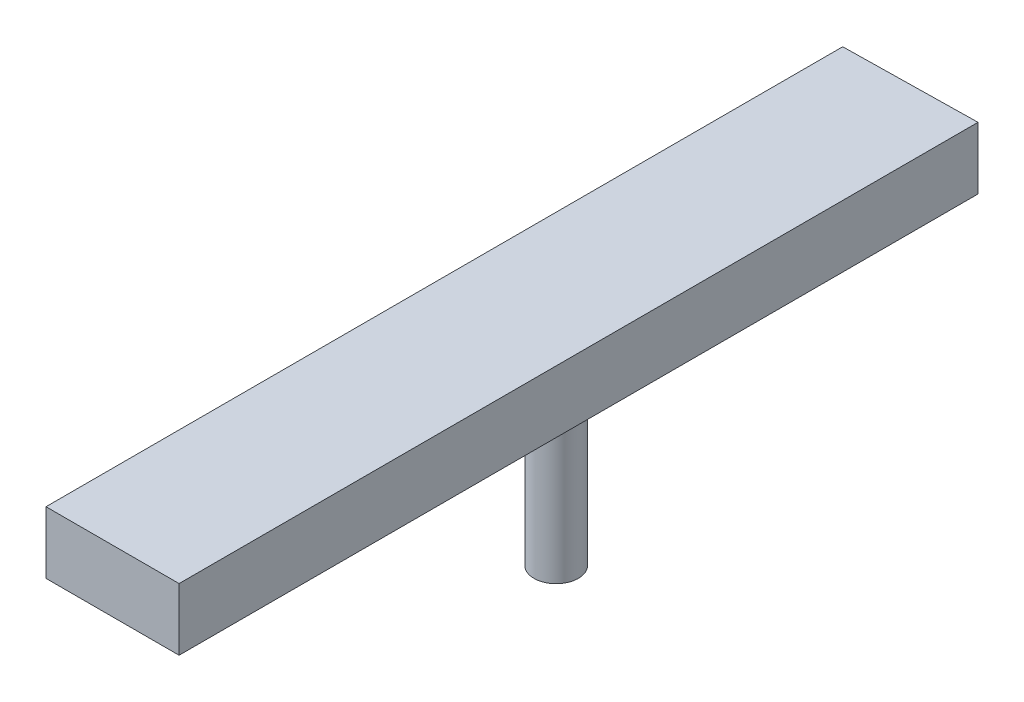
ISO-10303-21;
HEADER;
FILE_DESCRIPTION(('STEP AP214'),'2;1');
FILE_NAME('part.step','',(''),(''),'','','');
FILE_SCHEMA(('AUTOMOTIVE_DESIGN { 1 0 10303 214 1 1 1 1 }'));
ENDSEC;
DATA;
#1=APPLICATION_CONTEXT('core data for automotive mechanical design processes');
#2=APPLICATION_PROTOCOL_DEFINITION('international standard','automotive_design',2000,#1);
#3=PRODUCT_CONTEXT('',#1,'mechanical');
#4=PRODUCT('Part','Part','',(#3));
#5=PRODUCT_RELATED_PRODUCT_CATEGORY('part','',(#4));
#6=PRODUCT_DEFINITION_FORMATION('','',#4);
#7=PRODUCT_DEFINITION_CONTEXT('part definition',#1,'design');
#8=PRODUCT_DEFINITION('design','',#6,#7);
#9=PRODUCT_DEFINITION_SHAPE('','',#8);
#10=(LENGTH_UNIT() NAMED_UNIT(*) SI_UNIT(.MILLI.,.METRE.));
#11=(NAMED_UNIT(*) PLANE_ANGLE_UNIT() SI_UNIT($,.RADIAN.));
#12=(NAMED_UNIT(*) SI_UNIT($,.STERADIAN.) SOLID_ANGLE_UNIT());
#13=UNCERTAINTY_MEASURE_WITH_UNIT(LENGTH_MEASURE(1.E-05),#10,'distance_accuracy_value','');
#14=(GEOMETRIC_REPRESENTATION_CONTEXT(3) GLOBAL_UNCERTAINTY_ASSIGNED_CONTEXT((#13)) GLOBAL_UNIT_ASSIGNED_CONTEXT((#10,
#11,#12)) REPRESENTATION_CONTEXT('',''));
#15=CARTESIAN_POINT('',(0.,0.,0.));
#16=DIRECTION('',(0.,0.,1.));
#17=DIRECTION('',(1.,0.,0.));
#18=AXIS2_PLACEMENT_3D('',#15,#16,#17);
#19=CARTESIAN_POINT('',(7.49999983236194,0.,78.2764728704216));
#20=DIRECTION('',(0.,-1.,0.));
#21=DIRECTION('',(0.,0.,-1.));
#22=AXIS2_PLACEMENT_3D('',#19,#20,#21);
#23=PLANE('',#22);
#24=CARTESIAN_POINT('',(3.75000016356773,0.,35.0000012364363));
#25=DIRECTION('',(0.,-1.,0.));
#26=DIRECTION('',(0.,0.,-1.));
#27=AXIS2_PLACEMENT_3D('',#24,#25,#26);
#28=CIRCLE('',#27,1.2499992750272);
#29=CARTESIAN_POINT('',(3.75000016356773,0.,33.7500019614091));
#30=VERTEX_POINT('',#29);
#31=EDGE_CURVE('E11',#30,#30,#28,.T.);
#32=ORIENTED_EDGE('',*,*,#31,.F.);
#33=EDGE_LOOP('',(#32));
#34=FACE_BOUND('',#33,.T.);
#35=DIRECTION('',(0.,0.,-1.));
#36=VECTOR('',#35,1.);
#37=CARTESIAN_POINT('',(7.49999983236194,0.,78.2764728704216));
#38=LINE('',#37,#36);
#39=CARTESIAN_POINT('',(7.49999983236194,0.,60.0000002980232));
#40=VERTEX_POINT('',#39);
#41=CARTESIAN_POINT('',(7.49999983236194,0.,14.9775894310468));
#42=VERTEX_POINT('',#41);
#43=EDGE_CURVE('E47',#40,#42,#38,.T.);
#44=ORIENTED_EDGE('',*,*,#43,.F.);
#45=DIRECTION('',(1.,0.,0.));
#46=VECTOR('',#45,1.);
#47=CARTESIAN_POINT('',(0.,0.,60.0000002980232));
#48=LINE('',#47,#46);
#49=CARTESIAN_POINT('',(0.,0.,60.0000002980232));
#50=VERTEX_POINT('',#49);
#51=EDGE_CURVE('E54',#50,#40,#48,.T.);
#52=ORIENTED_EDGE('',*,*,#51,.F.);
#53=DIRECTION('',(0.,0.,-1.));
#54=VECTOR('',#53,1.);
#55=CARTESIAN_POINT('',(0.,0.,78.2764728704216));
#56=LINE('',#55,#54);
#57=CARTESIAN_POINT('',(0.,0.,15.1018444358906));
#58=VERTEX_POINT('',#57);
#59=EDGE_CURVE('E90',#50,#58,#56,.T.);
#60=ORIENTED_EDGE('',*,*,#59,.T.);
#61=DIRECTION('',(-0.999862789961335,0.,0.0165650611449047));
#62=VECTOR('',#61,1.);
#63=CARTESIAN_POINT('',(7.36187995923574,0.,14.9798777091652));
#64=LINE('',#63,#62);
#65=EDGE_CURVE('E110',#42,#58,#64,.T.);
#66=ORIENTED_EDGE('',*,*,#65,.F.);
#67=EDGE_LOOP('',(#44,#52,#60,#66));
#68=FACE_BOUND('',#67,.T.);
#69=ADVANCED_FACE('F40',(#34,#68),#23,.T.);
#70=CARTESIAN_POINT('',(0.,3.50000010803342,78.2764728704216));
#71=DIRECTION('',(-1.,0.,0.));
#72=DIRECTION('',(0.,0.,1.));
#73=AXIS2_PLACEMENT_3D('',#70,#71,#72);
#74=PLANE('',#73);
#75=ORIENTED_EDGE('',*,*,#59,.F.);
#76=DIRECTION('',(0.,-1.,0.));
#77=VECTOR('',#76,1.);
#78=CARTESIAN_POINT('',(0.,3.50000010803342,60.0000002980232));
#79=LINE('',#78,#77);
#80=CARTESIAN_POINT('',(0.,3.50000010803342,60.0000002980232));
#81=VERTEX_POINT('',#80);
#82=EDGE_CURVE('E80',#81,#50,#79,.T.);
#83=ORIENTED_EDGE('',*,*,#82,.F.);
#84=DIRECTION('',(0.,0.,-1.));
#85=VECTOR('',#84,1.);
#86=CARTESIAN_POINT('',(0.,3.50000010803342,78.2764728704216));
#87=LINE('',#86,#85);
#88=CARTESIAN_POINT('',(0.,3.50000010803342,15.1018444358906));
#89=VERTEX_POINT('',#88);
#90=EDGE_CURVE('E98',#81,#89,#87,.T.);
#91=ORIENTED_EDGE('',*,*,#90,.T.);
#92=DIRECTION('',(0.,1.,0.));
#93=VECTOR('',#92,1.);
#94=CARTESIAN_POINT('',(0.,0.,15.1018444358906));
#95=LINE('',#94,#93);
#96=EDGE_CURVE('E97',#58,#89,#95,.T.);
#97=ORIENTED_EDGE('',*,*,#96,.F.);
#98=EDGE_LOOP('',(#75,#83,#91,#97));
#99=FACE_BOUND('',#98,.T.);
#100=ADVANCED_FACE('F95',(#99),#74,.T.);
#101=CARTESIAN_POINT('',(7.49999983236194,3.50000010803342,78.2764728704216));
#102=DIRECTION('',(0.,1.,0.));
#103=DIRECTION('',(0.,0.,1.));
#104=AXIS2_PLACEMENT_3D('',#101,#102,#103);
#105=PLANE('',#104);
#106=ORIENTED_EDGE('',*,*,#90,.F.);
#107=DIRECTION('',(-1.,0.,0.));
#108=VECTOR('',#107,1.);
#109=CARTESIAN_POINT('',(0.,3.50000010803342,60.0000002980232));
#110=LINE('',#109,#108);
#111=CARTESIAN_POINT('',(7.49999983236194,3.50000010803342,60.0000002980232));
#112=VERTEX_POINT('',#111);
#113=EDGE_CURVE('E82',#112,#81,#110,.T.);
#114=ORIENTED_EDGE('',*,*,#113,.F.);
#115=DIRECTION('',(0.,0.,-1.));
#116=VECTOR('',#115,1.);
#117=CARTESIAN_POINT('',(7.49999983236194,3.50000010803342,78.2764728704216));
#118=LINE('',#117,#116);
#119=CARTESIAN_POINT('',(7.49999983236194,3.50000010803342,14.9775894310468));
#120=VERTEX_POINT('',#119);
#121=EDGE_CURVE('E62',#112,#120,#118,.T.);
#122=ORIENTED_EDGE('',*,*,#121,.T.);
#123=DIRECTION('',(0.999862789961335,0.,-0.0165650611449047));
#124=VECTOR('',#123,1.);
#125=CARTESIAN_POINT('',(-0.136061863791688,3.50000010803342,15.1040986182803));
#126=LINE('',#125,#124);
#127=EDGE_CURVE('E103',#89,#120,#126,.T.);
#128=ORIENTED_EDGE('',*,*,#127,.F.);
#129=EDGE_LOOP('',(#106,#114,#122,#128));
#130=FACE_BOUND('',#129,.T.);
#131=ADVANCED_FACE('F117',(#130),#105,.T.);
#132=CARTESIAN_POINT('',(7.49999983236194,3.50000010803342,78.2764728704216));
#133=DIRECTION('',(1.,0.,0.));
#134=DIRECTION('',(0.,0.,-1.));
#135=AXIS2_PLACEMENT_3D('',#132,#133,#134);
#136=PLANE('',#135);
#137=ORIENTED_EDGE('',*,*,#121,.F.);
#138=DIRECTION('',(0.,1.,0.));
#139=VECTOR('',#138,1.);
#140=CARTESIAN_POINT('',(7.49999983236194,3.50000010803342,60.0000002980232));
#141=LINE('',#140,#139);
#142=EDGE_CURVE('E92',#40,#112,#141,.T.);
#143=ORIENTED_EDGE('',*,*,#142,.F.);
#144=ORIENTED_EDGE('',*,*,#43,.T.);
#145=DIRECTION('',(0.,-1.,0.));
#146=VECTOR('',#145,1.);
#147=CARTESIAN_POINT('',(7.49999983236194,3.50000010803342,14.9775894310468));
#148=LINE('',#147,#146);
#149=EDGE_CURVE('E112',#120,#42,#148,.T.);
#150=ORIENTED_EDGE('',*,*,#149,.F.);
#151=EDGE_LOOP('',(#137,#143,#144,#150));
#152=FACE_BOUND('',#151,.T.);
#153=ADVANCED_FACE('F118',(#152),#136,.T.);
#154=CARTESIAN_POINT('',(3.75000016356773,3.53553185540002,35.0000012364363));
#155=DIRECTION('',(0.,-1.,0.));
#156=DIRECTION('',(0.,0.,-1.));
#157=AXIS2_PLACEMENT_3D('',#154,#155,#156);
#158=CYLINDRICAL_SURFACE('',#157,1.2499992750272);
#159=CARTESIAN_POINT('',(3.75000016356773,-9.99999977648258,35.0000012364363));
#160=DIRECTION('',(0.,-1.,0.));
#161=DIRECTION('',(0.,0.,-1.));
#162=AXIS2_PLACEMENT_3D('',#159,#160,#161);
#163=CIRCLE('',#162,1.2499992750272);
#164=CARTESIAN_POINT('',(3.75000016356773,-9.99999977648258,33.7500019614091));
#165=VERTEX_POINT('',#164);
#166=EDGE_CURVE('E99',#165,#165,#163,.T.);
#167=CARTESIAN_POINT('',(3.75000016356773,0.,33.7500019614091));
#168=CARTESIAN_POINT('',(3.75000016356773,-0.10416666433836,33.7500019614091));
#169=CARTESIAN_POINT('',(3.75000016356773,-0.20833332867672,33.7500019614091));
#170=CARTESIAN_POINT('',(3.75000016356773,-0.41666665735344,33.7500019614091));
#171=CARTESIAN_POINT('',(3.75000016356773,-0.5208333216918,33.7500019614091));
#172=CARTESIAN_POINT('',(3.75000016356773,-0.729166650368521,33.7500019614091));
#173=CARTESIAN_POINT('',(3.75000016356773,-0.833333314706881,33.7500019614091));
#174=CARTESIAN_POINT('',(3.75000016356773,-1.0416666433836,33.7500019614091));
#175=CARTESIAN_POINT('',(3.75000016356773,-1.14583330772196,33.7500019614091));
#176=CARTESIAN_POINT('',(3.75000016356773,-1.35416663639868,33.7500019614091));
#177=CARTESIAN_POINT('',(3.75000016356773,-1.45833330073704,33.7500019614091));
#178=CARTESIAN_POINT('',(3.75000016356773,-1.66666662941376,33.7500019614091));
#179=CARTESIAN_POINT('',(3.75000016356773,-1.77083329375212,33.7500019614091));
#180=CARTESIAN_POINT('',(3.75000016356773,-1.97916662242884,33.7500019614091));
#181=CARTESIAN_POINT('',(3.75000016356773,-2.0833332867672,33.7500019614091));
#182=CARTESIAN_POINT('',(3.75000016356773,-2.29166661544392,33.7500019614091));
#183=CARTESIAN_POINT('',(3.75000016356773,-2.39583327978228,33.7500019614091));
#184=CARTESIAN_POINT('',(3.75000016356773,-2.604166608459,33.7500019614091));
#185=CARTESIAN_POINT('',(3.75000016356773,-2.70833327279736,33.7500019614091));
#186=CARTESIAN_POINT('',(3.75000016356773,-2.91666660147408,33.7500019614091));
#187=CARTESIAN_POINT('',(3.75000016356773,-3.02083326581245,33.7500019614091));
#188=CARTESIAN_POINT('',(3.75000016356773,-3.22916659448917,33.7500019614091));
#189=CARTESIAN_POINT('',(3.75000016356773,-3.33333325882752,33.7500019614091));
#190=CARTESIAN_POINT('',(3.75000016356773,-3.54166658750425,33.7500019614091));
#191=CARTESIAN_POINT('',(3.75000016356773,-3.64583325184261,33.7500019614091));
#192=CARTESIAN_POINT('',(3.75000016356773,-3.85416658051933,33.7500019614091));
#193=CARTESIAN_POINT('',(3.75000016356773,-3.95833324485769,33.7500019614091));
#194=CARTESIAN_POINT('',(3.75000016356773,-4.16666657353441,33.7500019614091));
#195=CARTESIAN_POINT('',(3.75000016356773,-4.27083323787277,33.7500019614091));
#196=CARTESIAN_POINT('',(3.75000016356773,-4.47916656654949,33.7500019614091));
#197=CARTESIAN_POINT('',(3.75000016356773,-4.58333323088785,33.7500019614091));
#198=CARTESIAN_POINT('',(3.75000016356773,-4.79166655956457,33.7500019614091));
#199=CARTESIAN_POINT('',(3.75000016356773,-4.89583322390293,33.7500019614091));
#200=CARTESIAN_POINT('',(3.75000016356773,-5.10416655257965,33.7500019614091));
#201=CARTESIAN_POINT('',(3.75000016356773,-5.20833321691801,33.7500019614091));
#202=CARTESIAN_POINT('',(3.75000016356773,-5.41666654559473,33.7500019614091));
#203=CARTESIAN_POINT('',(3.75000016356773,-5.52083320993309,33.7500019614091));
#204=CARTESIAN_POINT('',(3.75000016356773,-5.72916653860981,33.7500019614091));
#205=CARTESIAN_POINT('',(3.75000016356773,-5.83333320294817,33.7500019614091));
#206=CARTESIAN_POINT('',(3.75000016356773,-6.04166653162489,33.7500019614091));
#207=CARTESIAN_POINT('',(3.75000016356773,-6.14583319596325,33.7500019614091));
#208=CARTESIAN_POINT('',(3.75000016356773,-6.35416652463997,33.7500019614091));
#209=CARTESIAN_POINT('',(3.75000016356773,-6.45833318897833,33.7500019614091));
#210=CARTESIAN_POINT('',(3.75000016356773,-6.66666651765505,33.7500019614091));
#211=CARTESIAN_POINT('',(3.75000016356773,-6.77083318199341,33.7500019614091));
#212=CARTESIAN_POINT('',(3.75000016356773,-6.97916651067013,33.7500019614091));
#213=CARTESIAN_POINT('',(3.75000016356773,-7.08333317500849,33.7500019614091));
#214=CARTESIAN_POINT('',(3.75000016356773,-7.29166650368521,33.7500019614091));
#215=CARTESIAN_POINT('',(3.75000016356773,-7.39583316802357,33.7500019614091));
#216=CARTESIAN_POINT('',(3.75000016356773,-7.60416649670029,33.7500019614091));
#217=CARTESIAN_POINT('',(3.75000016356773,-7.70833316103865,33.7500019614091));
#218=CARTESIAN_POINT('',(3.75000016356773,-7.91666648971537,33.7500019614091));
#219=CARTESIAN_POINT('',(3.75000016356773,-8.02083315405373,33.7500019614091));
#220=CARTESIAN_POINT('',(3.75000016356773,-8.22916648273045,33.7500019614091));
#221=CARTESIAN_POINT('',(3.75000016356773,-8.33333314706881,33.7500019614091));
#222=CARTESIAN_POINT('',(3.75000016356773,-8.54166647574553,33.7500019614091));
#223=CARTESIAN_POINT('',(3.75000016356773,-8.64583314008389,33.7500019614091));
#224=CARTESIAN_POINT('',(3.75000016356773,-8.85416646876061,33.7500019614091));
#225=CARTESIAN_POINT('',(3.75000016356773,-8.95833313309898,33.7500019614091));
#226=CARTESIAN_POINT('',(3.75000016356773,-9.16666646177569,33.7500019614091));
#227=CARTESIAN_POINT('',(3.75000016356773,-9.27083312611406,33.7500019614091));
#228=CARTESIAN_POINT('',(3.75000016356773,-9.47916645479078,33.7500019614091));
#229=CARTESIAN_POINT('',(3.75000016356773,-9.58333311912914,33.7500019614091));
#230=CARTESIAN_POINT('',(3.75000016356773,-9.79166644780586,33.7500019614091));
#231=CARTESIAN_POINT('',(3.75000016356773,-9.89583311214422,33.7500019614091));
#232=CARTESIAN_POINT('',(3.75000016356773,-9.99999977648258,33.7500019614091));
#233=B_SPLINE_CURVE_WITH_KNOTS('',3,(#167,#168,#169,#170,#171,#172,#173,#174,#175,#176,#177,
#178,#179,#180,#181,#182,#183,#184,#185,#186,#187,#188,#189,#190,#191,#192,#193,#194,#195,#196,
#197,#198,#199,#200,#201,#202,#203,#204,#205,#206,#207,#208,#209,#210,#211,#212,#213,#214,#215,
#216,#217,#218,#219,#220,#221,#222,#223,#224,#225,#226,#227,#228,#229,#230,#231,#232),
.UNSPECIFIED.,.F.,.F.,(4,2,2,2,2,2,2,2,2,2,2,2,2,2,2,2,2,2,2,2,2,2,2,2,2,2,2,2,2,2,2,2,4),(0.,
0.312499993015081,0.624999986030161,0.937499979045242,1.24999997206032,1.5624999650754,
1.87499995809048,2.18749995110556,2.49999994412064,2.81249993713572,3.12499993015081,
3.43749992316589,3.74999991618097,4.06249990919605,4.37499990221113,4.68749989522621,
4.99999988824129,5.31249988125637,5.62499987427145,5.93749986728653,6.24999986030161,
6.56249985331669,6.87499984633177,7.18749983934685,7.49999983236193,7.81249982537701,
8.12499981839209,8.43749981140718,8.74999980442226,9.06249979743734,9.37499979045242,
9.6874997834675,9.99999977648258),.UNSPECIFIED.);
#234=EDGE_CURVE('BSEAM130',#30,#165,#233,.T.);
#235=ORIENTED_EDGE('',*,*,#31,.T.);
#236=ORIENTED_EDGE('',*,*,#166,.F.);
#237=ORIENTED_EDGE('',*,*,#234,.T.);
#238=ORIENTED_EDGE('',*,*,#234,.F.);
#239=EDGE_LOOP('',(#235,#237,#236,#238));
#240=FACE_BOUND('',#239,.T.);
#241=ADVANCED_FACE('F130',(#240),#158,.T.);
#242=CARTESIAN_POINT('',(3.75000016356773,-9.99999977648258,35.0000012364363));
#243=DIRECTION('',(0.,-1.,0.));
#244=DIRECTION('',(0.,0.,-1.));
#245=AXIS2_PLACEMENT_3D('',#242,#243,#244);
#246=PLANE('',#245);
#247=ORIENTED_EDGE('',*,*,#166,.T.);
#248=EDGE_LOOP('',(#247));
#249=FACE_BOUND('',#248,.T.);
#250=ADVANCED_FACE('F122',(#249),#246,.T.);
#251=CARTESIAN_POINT('',(6.7509066981884,11.8999999962747,14.9899999074595));
#252=DIRECTION('',(0.0165650611449047,0.,0.999862789961336));
#253=DIRECTION('',(0.999862789961336,0.,-0.0165650611449047));
#254=AXIS2_PLACEMENT_3D('',#251,#252,#253);
#255=PLANE('',#254);
#256=ORIENTED_EDGE('',*,*,#127,.T.);
#257=ORIENTED_EDGE('',*,*,#149,.T.);
#258=ORIENTED_EDGE('',*,*,#65,.T.);
#259=ORIENTED_EDGE('',*,*,#96,.T.);
#260=EDGE_LOOP('',(#256,#257,#258,#259));
#261=FACE_BOUND('',#260,.T.);
#262=ADVANCED_FACE('F120',(#261),#255,.F.);
#263=CARTESIAN_POINT('',(0.,0.,60.0000002980232));
#264=DIRECTION('',(0.,0.,1.));
#265=DIRECTION('',(1.,0.,0.));
#266=AXIS2_PLACEMENT_3D('',#263,#264,#265);
#267=PLANE('',#266);
#268=ORIENTED_EDGE('',*,*,#82,.T.);
#269=ORIENTED_EDGE('',*,*,#51,.T.);
#270=ORIENTED_EDGE('',*,*,#142,.T.);
#271=ORIENTED_EDGE('',*,*,#113,.T.);
#272=EDGE_LOOP('',(#268,#269,#270,#271));
#273=FACE_BOUND('',#272,.T.);
#274=ADVANCED_FACE('F81',(#273),#267,.T.);
#275=CLOSED_SHELL('',(#69,#100,#131,#153,#241,#250,#262,#274));
#276=MANIFOLD_SOLID_BREP('B2',#275);
#277=ADVANCED_BREP_SHAPE_REPRESENTATION('',(#18,#276),#14);
#278=SHAPE_DEFINITION_REPRESENTATION(#9,#277);
ENDSEC;
END-ISO-10303-21;
